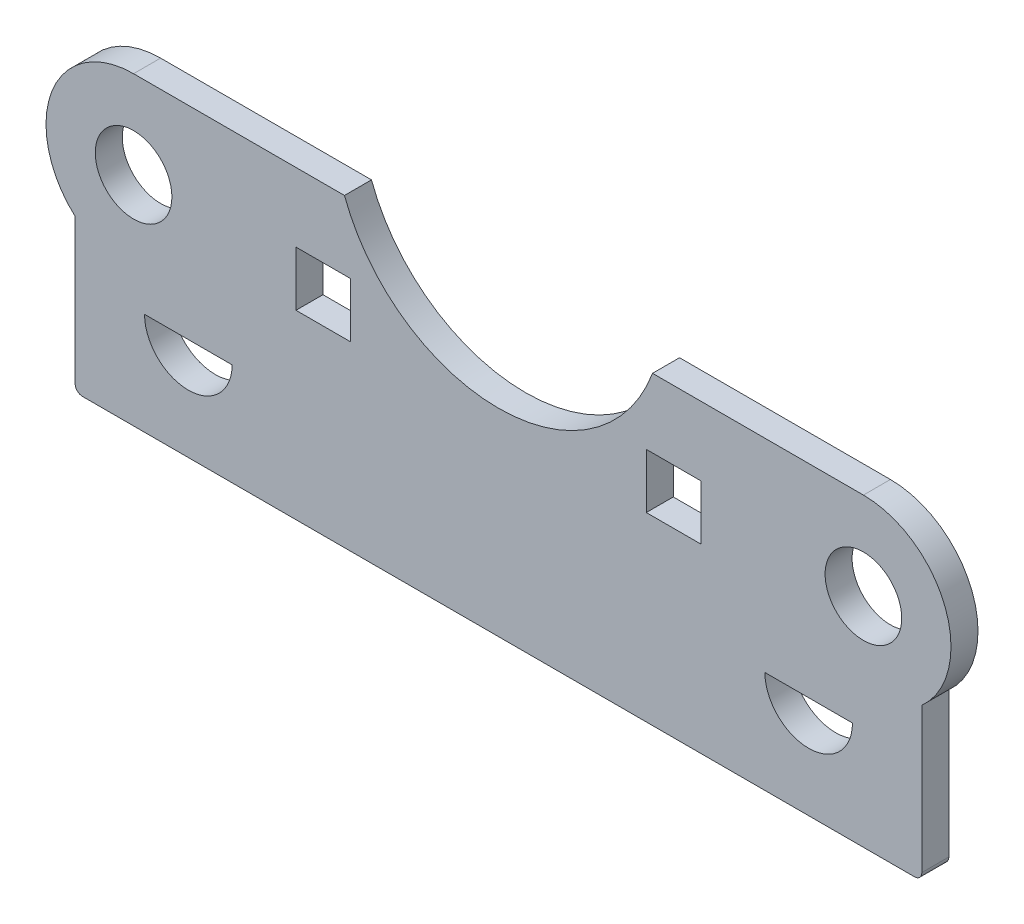
ISO-10303-21;
HEADER;
FILE_DESCRIPTION(('STEP AP214'),'2;1');
FILE_NAME('part.step','',(''),(''),'','','');
FILE_SCHEMA(('AUTOMOTIVE_DESIGN { 1 0 10303 214 1 1 1 1 }'));
ENDSEC;
DATA;
#1=APPLICATION_CONTEXT('core data for automotive mechanical design processes');
#2=APPLICATION_PROTOCOL_DEFINITION('international standard','automotive_design',2000,#1);
#3=PRODUCT_CONTEXT('',#1,'mechanical');
#4=PRODUCT('Part','Part','',(#3));
#5=PRODUCT_RELATED_PRODUCT_CATEGORY('part','',(#4));
#6=PRODUCT_DEFINITION_FORMATION('','',#4);
#7=PRODUCT_DEFINITION_CONTEXT('part definition',#1,'design');
#8=PRODUCT_DEFINITION('design','',#6,#7);
#9=PRODUCT_DEFINITION_SHAPE('','',#8);
#10=(LENGTH_UNIT() NAMED_UNIT(*) SI_UNIT(.MILLI.,.METRE.));
#11=(NAMED_UNIT(*) PLANE_ANGLE_UNIT() SI_UNIT($,.RADIAN.));
#12=(NAMED_UNIT(*) SI_UNIT($,.STERADIAN.) SOLID_ANGLE_UNIT());
#13=UNCERTAINTY_MEASURE_WITH_UNIT(LENGTH_MEASURE(1.E-05),#10,'distance_accuracy_value','');
#14=(GEOMETRIC_REPRESENTATION_CONTEXT(3) GLOBAL_UNCERTAINTY_ASSIGNED_CONTEXT((#13)) GLOBAL_UNIT_ASSIGNED_CONTEXT((#10,
#11,#12)) REPRESENTATION_CONTEXT('',''));
#15=CARTESIAN_POINT('',(0.,0.,0.));
#16=DIRECTION('',(0.,0.,1.));
#17=DIRECTION('',(1.,0.,0.));
#18=AXIS2_PLACEMENT_3D('',#15,#16,#17);
#19=CARTESIAN_POINT('',(-1974.85,0.,-93.98));
#20=DIRECTION('',(-1.,0.,0.));
#21=DIRECTION('',(0.,0.,1.));
#22=AXIS2_PLACEMENT_3D('',#19,#20,#21);
#23=PLANE('',#22);
#24=DIRECTION('',(0.,-1.,0.));
#25=VECTOR('',#24,1.);
#26=CARTESIAN_POINT('',(-1974.85,0.,0.));
#27=LINE('',#26,#25);
#28=CARTESIAN_POINT('',(-1974.85,64.7699999999994,0.));
#29=VERTEX_POINT('',#28);
#30=CARTESIAN_POINT('',(-1974.85,-125.730000000001,0.));
#31=VERTEX_POINT('',#30);
#32=EDGE_CURVE('E263',#29,#31,#27,.T.);
#33=ORIENTED_EDGE('',*,*,#32,.T.);
#34=DIRECTION('',(0.,0.,1.));
#35=VECTOR('',#34,1.);
#36=CARTESIAN_POINT('',(-1974.85,-125.730000000001,-93.98));
#37=LINE('',#36,#35);
#38=CARTESIAN_POINT('',(-1974.85,-125.730000000001,-93.98));
#39=VERTEX_POINT('',#38);
#40=EDGE_CURVE('E11',#39,#31,#37,.T.);
#41=ORIENTED_EDGE('',*,*,#40,.F.);
#42=DIRECTION('',(0.,-1.,0.));
#43=VECTOR('',#42,1.);
#44=CARTESIAN_POINT('',(-1974.85,0.,-93.98));
#45=LINE('',#44,#43);
#46=CARTESIAN_POINT('',(-1974.85,64.7699999999994,-93.98));
#47=VERTEX_POINT('',#46);
#48=EDGE_CURVE('E52',#47,#39,#45,.T.);
#49=ORIENTED_EDGE('',*,*,#48,.F.);
#50=DIRECTION('',(0.,0.,1.));
#51=VECTOR('',#50,1.);
#52=CARTESIAN_POINT('',(-1974.85,64.7699999999994,-93.98));
#53=LINE('',#52,#51);
#54=EDGE_CURVE('E197',#47,#29,#53,.T.);
#55=ORIENTED_EDGE('',*,*,#54,.T.);
#56=EDGE_LOOP('',(#33,#41,#49,#55));
#57=FACE_BOUND('',#56,.T.);
#58=ADVANCED_FACE('F33',(#57),#23,.F.);
#59=CARTESIAN_POINT('',(0.,-125.73,-93.98));
#60=DIRECTION('',(0.,1.,0.));
#61=DIRECTION('',(-1.,0.,0.));
#62=AXIS2_PLACEMENT_3D('',#59,#60,#61);
#63=PLANE('',#62);
#64=DIRECTION('',(-1.,0.,0.));
#65=VECTOR('',#64,1.);
#66=CARTESIAN_POINT('',(0.,-125.73,0.));
#67=LINE('',#66,#65);
#68=CARTESIAN_POINT('',(-1784.35,-125.730000000001,0.));
#69=VERTEX_POINT('',#68);
#70=EDGE_CURVE('E268',#69,#31,#67,.T.);
#71=ORIENTED_EDGE('',*,*,#70,.F.);
#72=DIRECTION('',(0.,0.,1.));
#73=VECTOR('',#72,1.);
#74=CARTESIAN_POINT('',(-1784.35,-125.730000000001,-93.98));
#75=LINE('',#74,#73);
#76=CARTESIAN_POINT('',(-1784.35,-125.730000000001,-93.98));
#77=VERTEX_POINT('',#76);
#78=EDGE_CURVE('E43',#77,#69,#75,.T.);
#79=ORIENTED_EDGE('',*,*,#78,.F.);
#80=DIRECTION('',(-1.,0.,0.));
#81=VECTOR('',#80,1.);
#82=CARTESIAN_POINT('',(0.,-125.73,-93.98));
#83=LINE('',#82,#81);
#84=EDGE_CURVE('E205',#77,#39,#83,.T.);
#85=ORIENTED_EDGE('',*,*,#84,.T.);
#86=ORIENTED_EDGE('',*,*,#40,.T.);
#87=EDGE_LOOP('',(#71,#79,#85,#86));
#88=FACE_BOUND('',#87,.T.);
#89=ADVANCED_FACE('F337',(#88),#63,.T.);
#90=CARTESIAN_POINT('',(-1784.35,0.,-93.98));
#91=DIRECTION('',(-1.,0.,0.));
#92=DIRECTION('',(0.,0.,1.));
#93=AXIS2_PLACEMENT_3D('',#90,#91,#92);
#94=PLANE('',#93);
#95=DIRECTION('',(0.,-1.,0.));
#96=VECTOR('',#95,1.);
#97=CARTESIAN_POINT('',(-1784.35,0.,0.));
#98=LINE('',#97,#96);
#99=CARTESIAN_POINT('',(-1784.35,64.7699999999995,0.));
#100=VERTEX_POINT('',#99);
#101=EDGE_CURVE('E194',#100,#69,#98,.T.);
#102=ORIENTED_EDGE('',*,*,#101,.F.);
#103=DIRECTION('',(0.,0.,1.));
#104=VECTOR('',#103,1.);
#105=CARTESIAN_POINT('',(-1784.35,64.7699999999995,-93.98));
#106=LINE('',#105,#104);
#107=CARTESIAN_POINT('',(-1784.35,64.7699999999995,-93.98));
#108=VERTEX_POINT('',#107);
#109=EDGE_CURVE('E189',#108,#100,#106,.T.);
#110=ORIENTED_EDGE('',*,*,#109,.F.);
#111=DIRECTION('',(0.,-1.,0.));
#112=VECTOR('',#111,1.);
#113=CARTESIAN_POINT('',(-1784.35,0.,-93.98));
#114=LINE('',#113,#112);
#115=EDGE_CURVE('E193',#108,#77,#114,.T.);
#116=ORIENTED_EDGE('',*,*,#115,.T.);
#117=ORIENTED_EDGE('',*,*,#78,.T.);
#118=EDGE_LOOP('',(#102,#110,#116,#117));
#119=FACE_BOUND('',#118,.T.);
#120=ADVANCED_FACE('F191',(#119),#94,.T.);
#121=CARTESIAN_POINT('',(-755.65,-4.40388466434645E-13,-93.98));
#122=DIRECTION('',(-1.,0.,0.));
#123=DIRECTION('',(0.,-1.,0.));
#124=AXIS2_PLACEMENT_3D('',#121,#122,#123);
#125=PLANE('',#124);
#126=DIRECTION('',(0.,-1.,0.));
#127=VECTOR('',#126,1.);
#128=CARTESIAN_POINT('',(-755.65,-4.40388466434645E-13,0.));
#129=LINE('',#128,#127);
#130=CARTESIAN_POINT('',(-755.65,64.7699999999998,0.));
#131=VERTEX_POINT('',#130);
#132=CARTESIAN_POINT('',(-755.649999999999,-125.73,0.));
#133=VERTEX_POINT('',#132);
#134=EDGE_CURVE('E252',#131,#133,#129,.T.);
#135=ORIENTED_EDGE('',*,*,#134,.T.);
#136=DIRECTION('',(0.,0.,1.));
#137=VECTOR('',#136,1.);
#138=CARTESIAN_POINT('',(-755.649999999999,-125.73,-93.98));
#139=LINE('',#138,#137);
#140=CARTESIAN_POINT('',(-755.649999999999,-125.73,-93.98));
#141=VERTEX_POINT('',#140);
#142=EDGE_CURVE('E274',#141,#133,#139,.T.);
#143=ORIENTED_EDGE('',*,*,#142,.F.);
#144=DIRECTION('',(0.,-1.,0.));
#145=VECTOR('',#144,1.);
#146=CARTESIAN_POINT('',(-755.65,-4.40388466434645E-13,-93.98));
#147=LINE('',#146,#145);
#148=CARTESIAN_POINT('',(-755.65,64.7699999999998,-93.98));
#149=VERTEX_POINT('',#148);
#150=EDGE_CURVE('E459',#149,#141,#147,.T.);
#151=ORIENTED_EDGE('',*,*,#150,.F.);
#152=DIRECTION('',(0.,0.,1.));
#153=VECTOR('',#152,1.);
#154=CARTESIAN_POINT('',(-755.65,64.7699999999998,-93.98));
#155=LINE('',#154,#153);
#156=EDGE_CURVE('E280',#149,#131,#155,.T.);
#157=ORIENTED_EDGE('',*,*,#156,.T.);
#158=EDGE_LOOP('',(#135,#143,#151,#157));
#159=FACE_BOUND('',#158,.T.);
#160=ADVANCED_FACE('F350',(#159),#125,.F.);
#161=CARTESIAN_POINT('',(0.,-125.73,-93.98));
#162=DIRECTION('',(0.,1.,0.));
#163=DIRECTION('',(-1.,0.,0.));
#164=AXIS2_PLACEMENT_3D('',#161,#162,#163);
#165=PLANE('',#164);
#166=DIRECTION('',(-1.,0.,0.));
#167=VECTOR('',#166,1.);
#168=CARTESIAN_POINT('',(0.,-125.73,0.));
#169=LINE('',#168,#167);
#170=CARTESIAN_POINT('',(-565.15,-125.73,0.));
#171=VERTEX_POINT('',#170);
#172=EDGE_CURVE('E260',#171,#133,#169,.T.);
#173=ORIENTED_EDGE('',*,*,#172,.F.);
#174=DIRECTION('',(0.,0.,1.));
#175=VECTOR('',#174,1.);
#176=CARTESIAN_POINT('',(-565.15,-125.73,-93.98));
#177=LINE('',#176,#175);
#178=CARTESIAN_POINT('',(-565.15,-125.73,-93.98));
#179=VERTEX_POINT('',#178);
#180=EDGE_CURVE('E276',#179,#171,#177,.T.);
#181=ORIENTED_EDGE('',*,*,#180,.F.);
#182=DIRECTION('',(-1.,0.,0.));
#183=VECTOR('',#182,1.);
#184=CARTESIAN_POINT('',(0.,-125.73,-93.98));
#185=LINE('',#184,#183);
#186=EDGE_CURVE('E466',#179,#141,#185,.T.);
#187=ORIENTED_EDGE('',*,*,#186,.T.);
#188=ORIENTED_EDGE('',*,*,#142,.T.);
#189=EDGE_LOOP('',(#173,#181,#187,#188));
#190=FACE_BOUND('',#189,.T.);
#191=ADVANCED_FACE('F346',(#190),#165,.T.);
#192=CARTESIAN_POINT('',(-565.15,0.,-93.98));
#193=DIRECTION('',(-1.,0.,0.));
#194=DIRECTION('',(0.,0.,1.));
#195=AXIS2_PLACEMENT_3D('',#192,#193,#194);
#196=PLANE('',#195);
#197=DIRECTION('',(0.,-1.,0.));
#198=VECTOR('',#197,1.);
#199=CARTESIAN_POINT('',(-565.15,0.,0.));
#200=LINE('',#199,#198);
#201=CARTESIAN_POINT('',(-565.15,64.7699999999998,0.));
#202=VERTEX_POINT('',#201);
#203=EDGE_CURVE('E257',#202,#171,#200,.T.);
#204=ORIENTED_EDGE('',*,*,#203,.F.);
#205=DIRECTION('',(0.,0.,1.));
#206=VECTOR('',#205,1.);
#207=CARTESIAN_POINT('',(-565.15,64.7699999999998,-93.98));
#208=LINE('',#207,#206);
#209=CARTESIAN_POINT('',(-565.15,64.7699999999998,-93.98));
#210=VERTEX_POINT('',#209);
#211=EDGE_CURVE('E278',#210,#202,#208,.T.);
#212=ORIENTED_EDGE('',*,*,#211,.F.);
#213=DIRECTION('',(0.,-1.,0.));
#214=VECTOR('',#213,1.);
#215=CARTESIAN_POINT('',(-565.15,0.,-93.98));
#216=LINE('',#215,#214);
#217=EDGE_CURVE('E463',#210,#179,#216,.T.);
#218=ORIENTED_EDGE('',*,*,#217,.T.);
#219=ORIENTED_EDGE('',*,*,#180,.T.);
#220=EDGE_LOOP('',(#204,#212,#218,#219));
#221=FACE_BOUND('',#220,.T.);
#222=ADVANCED_FACE('F349',(#221),#196,.T.);
#223=CARTESIAN_POINT('',(-2717.8,-731.520000000001,-93.98));
#224=DIRECTION('',(0.,0.,1.));
#225=DIRECTION('',(1.,0.,0.));
#226=AXIS2_PLACEMENT_3D('',#223,#224,#225);
#227=CYLINDRICAL_SURFACE('',#226,25.3999999999999);
#228=CARTESIAN_POINT('',(-2717.8,-731.520000000001,0.));
#229=DIRECTION('',(0.,0.,1.));
#230=DIRECTION('',(1.,0.,0.));
#231=AXIS2_PLACEMENT_3D('',#228,#229,#230);
#232=CIRCLE('',#231,25.3999999999999);
#233=CARTESIAN_POINT('',(-2717.8,-756.920000000001,0.));
#234=VERTEX_POINT('',#233);
#235=CARTESIAN_POINT('',(-2743.2,-731.520000000001,0.));
#236=VERTEX_POINT('',#235);
#237=EDGE_CURVE('E220',#234,#236,#232,.F.);
#238=ORIENTED_EDGE('',*,*,#237,.T.);
#239=DIRECTION('',(0.,0.,1.));
#240=VECTOR('',#239,1.);
#241=CARTESIAN_POINT('',(-2743.2,-731.520000000001,-93.98));
#242=LINE('',#241,#240);
#243=CARTESIAN_POINT('',(-2743.2,-731.520000000001,-93.98));
#244=VERTEX_POINT('',#243);
#245=EDGE_CURVE('E283',#244,#236,#242,.T.);
#246=ORIENTED_EDGE('',*,*,#245,.F.);
#247=CARTESIAN_POINT('',(-2717.8,-731.520000000001,-93.98));
#248=DIRECTION('',(0.,0.,1.));
#249=DIRECTION('',(1.,0.,0.));
#250=AXIS2_PLACEMENT_3D('',#247,#248,#249);
#251=CIRCLE('',#250,25.3999999999999);
#252=CARTESIAN_POINT('',(-2717.8,-756.920000000001,-93.98));
#253=VERTEX_POINT('',#252);
#254=EDGE_CURVE('E422',#253,#244,#251,.F.);
#255=ORIENTED_EDGE('',*,*,#254,.F.);
#256=DIRECTION('',(0.,0.,1.));
#257=VECTOR('',#256,1.);
#258=CARTESIAN_POINT('',(-2717.8,-756.920000000001,-93.98));
#259=LINE('',#258,#257);
#260=EDGE_CURVE('E305',#253,#234,#259,.T.);
#261=ORIENTED_EDGE('',*,*,#260,.T.);
#262=EDGE_LOOP('',(#238,#246,#255,#261));
#263=FACE_BOUND('',#262,.T.);
#264=ADVANCED_FACE('F354',(#263),#227,.T.);
#265=CARTESIAN_POINT('',(-2743.2,0.,-93.98));
#266=DIRECTION('',(1.,0.,0.));
#267=DIRECTION('',(0.,0.,-1.));
#268=AXIS2_PLACEMENT_3D('',#265,#266,#267);
#269=PLANE('',#268);
#270=DIRECTION('',(0.,1.,0.));
#271=VECTOR('',#270,1.);
#272=CARTESIAN_POINT('',(-2743.2,0.,0.));
#273=LINE('',#272,#271);
#274=CARTESIAN_POINT('',(-2743.2,-227.184506513979,0.));
#275=VERTEX_POINT('',#274);
#276=EDGE_CURVE('E243',#236,#275,#273,.T.);
#277=ORIENTED_EDGE('',*,*,#276,.T.);
#278=DIRECTION('',(0.,0.,1.));
#279=VECTOR('',#278,1.);
#280=CARTESIAN_POINT('',(-2743.2,-227.184506513979,-93.98));
#281=LINE('',#280,#279);
#282=CARTESIAN_POINT('',(-2743.2,-227.184506513979,-93.98));
#283=VERTEX_POINT('',#282);
#284=EDGE_CURVE('E286',#283,#275,#281,.T.);
#285=ORIENTED_EDGE('',*,*,#284,.F.);
#286=DIRECTION('',(0.,1.,0.));
#287=VECTOR('',#286,1.);
#288=CARTESIAN_POINT('',(-2743.2,0.,-93.98));
#289=LINE('',#288,#287);
#290=EDGE_CURVE('E451',#244,#283,#289,.T.);
#291=ORIENTED_EDGE('',*,*,#290,.F.);
#292=ORIENTED_EDGE('',*,*,#245,.T.);
#293=EDGE_LOOP('',(#277,#285,#291,#292));
#294=FACE_BOUND('',#293,.T.);
#295=ADVANCED_FACE('F371',(#294),#269,.F.);
#296=CARTESIAN_POINT('',(-2540.,0.,-93.98));
#297=DIRECTION('',(0.,0.,1.));
#298=DIRECTION('',(1.,0.,0.));
#299=AXIS2_PLACEMENT_3D('',#296,#297,#298);
#300=CYLINDRICAL_SURFACE('',#299,304.8);
#301=CARTESIAN_POINT('',(-2540.,0.,0.));
#302=DIRECTION('',(0.,0.,1.));
#303=DIRECTION('',(1.,0.,0.));
#304=AXIS2_PLACEMENT_3D('',#301,#302,#303);
#305=CIRCLE('',#304,304.8);
#306=CARTESIAN_POINT('',(-2540.,304.8,0.));
#307=VERTEX_POINT('',#306);
#308=EDGE_CURVE('E240',#307,#275,#305,.T.);
#309=ORIENTED_EDGE('',*,*,#308,.F.);
#310=DIRECTION('',(0.,0.,1.));
#311=VECTOR('',#310,1.);
#312=CARTESIAN_POINT('',(-2540.,304.8,-93.98));
#313=LINE('',#312,#311);
#314=CARTESIAN_POINT('',(-2540.,304.8,-93.98));
#315=VERTEX_POINT('',#314);
#316=EDGE_CURVE('E288',#315,#307,#313,.T.);
#317=ORIENTED_EDGE('',*,*,#316,.F.);
#318=CARTESIAN_POINT('',(-2540.,0.,-93.98));
#319=DIRECTION('',(0.,0.,1.));
#320=DIRECTION('',(1.,0.,0.));
#321=AXIS2_PLACEMENT_3D('',#318,#319,#320);
#322=CIRCLE('',#321,304.8);
#323=EDGE_CURVE('E448',#315,#283,#322,.T.);
#324=ORIENTED_EDGE('',*,*,#323,.T.);
#325=ORIENTED_EDGE('',*,*,#284,.T.);
#326=EDGE_LOOP('',(#309,#317,#324,#325));
#327=FACE_BOUND('',#326,.T.);
#328=ADVANCED_FACE('F374',(#327),#300,.T.);
#329=CARTESIAN_POINT('',(0.,304.8,-93.98));
#330=DIRECTION('',(0.,-1.,0.));
#331=DIRECTION('',(0.,0.,-1.));
#332=AXIS2_PLACEMENT_3D('',#329,#330,#331);
#333=PLANE('',#332);
#334=DIRECTION('',(1.,0.,0.));
#335=VECTOR('',#334,1.);
#336=CARTESIAN_POINT('',(0.,304.8,0.));
#337=LINE('',#336,#335);
#338=CARTESIAN_POINT('',(-1806.06036563059,304.8,0.));
#339=VERTEX_POINT('',#338);
#340=EDGE_CURVE('E238',#307,#339,#337,.T.);
#341=ORIENTED_EDGE('',*,*,#340,.T.);
#342=DIRECTION('',(0.,0.,1.));
#343=VECTOR('',#342,1.);
#344=CARTESIAN_POINT('',(-1806.06036563059,304.8,-93.98));
#345=LINE('',#344,#343);
#346=CARTESIAN_POINT('',(-1806.06036563059,304.8,-93.98));
#347=VERTEX_POINT('',#346);
#348=EDGE_CURVE('E290',#347,#339,#345,.T.);
#349=ORIENTED_EDGE('',*,*,#348,.F.);
#350=DIRECTION('',(1.,0.,0.));
#351=VECTOR('',#350,1.);
#352=CARTESIAN_POINT('',(0.,304.8,-93.98));
#353=LINE('',#352,#351);
#354=EDGE_CURVE('E446',#315,#347,#353,.T.);
#355=ORIENTED_EDGE('',*,*,#354,.F.);
#356=ORIENTED_EDGE('',*,*,#316,.T.);
#357=EDGE_LOOP('',(#341,#349,#355,#356));
#358=FACE_BOUND('',#357,.T.);
#359=ADVANCED_FACE('F378',(#358),#333,.F.);
#360=CARTESIAN_POINT('',(-1270.,502.92,-93.98));
#361=DIRECTION('',(0.,0.,1.));
#362=DIRECTION('',(1.,0.,0.));
#363=AXIS2_PLACEMENT_3D('',#360,#361,#362);
#364=CYLINDRICAL_SURFACE('',#363,571.5);
#365=CARTESIAN_POINT('',(-1270.,502.92,0.));
#366=DIRECTION('',(0.,0.,1.));
#367=DIRECTION('',(1.,0.,0.));
#368=AXIS2_PLACEMENT_3D('',#365,#366,#367);
#369=CIRCLE('',#368,571.5);
#370=CARTESIAN_POINT('',(-733.939634369412,304.8,0.));
#371=VERTEX_POINT('',#370);
#372=EDGE_CURVE('E236',#339,#371,#369,.T.);
#373=ORIENTED_EDGE('',*,*,#372,.T.);
#374=DIRECTION('',(0.,0.,1.));
#375=VECTOR('',#374,1.);
#376=CARTESIAN_POINT('',(-733.939634369412,304.8,-93.98));
#377=LINE('',#376,#375);
#378=CARTESIAN_POINT('',(-733.939634369412,304.8,-93.98));
#379=VERTEX_POINT('',#378);
#380=EDGE_CURVE('E293',#379,#371,#377,.T.);
#381=ORIENTED_EDGE('',*,*,#380,.F.);
#382=CARTESIAN_POINT('',(-1270.,502.92,-93.98));
#383=DIRECTION('',(0.,0.,1.));
#384=DIRECTION('',(1.,0.,0.));
#385=AXIS2_PLACEMENT_3D('',#382,#383,#384);
#386=CIRCLE('',#385,571.5);
#387=EDGE_CURVE('E444',#347,#379,#386,.T.);
#388=ORIENTED_EDGE('',*,*,#387,.F.);
#389=ORIENTED_EDGE('',*,*,#348,.T.);
#390=EDGE_LOOP('',(#373,#381,#388,#389));
#391=FACE_BOUND('',#390,.T.);
#392=ADVANCED_FACE('F382',(#391),#364,.F.);
#393=CARTESIAN_POINT('',(0.,304.8,-93.98));
#394=DIRECTION('',(0.,-1.,0.));
#395=DIRECTION('',(1.,0.,0.));
#396=AXIS2_PLACEMENT_3D('',#393,#394,#395);
#397=PLANE('',#396);
#398=DIRECTION('',(1.,0.,0.));
#399=VECTOR('',#398,1.);
#400=CARTESIAN_POINT('',(0.,304.8,0.));
#401=LINE('',#400,#399);
#402=CARTESIAN_POINT('',(0.,304.8,0.));
#403=VERTEX_POINT('',#402);
#404=EDGE_CURVE('E233',#371,#403,#401,.T.);
#405=ORIENTED_EDGE('',*,*,#404,.T.);
#406=DIRECTION('',(0.,0.,1.));
#407=VECTOR('',#406,1.);
#408=CARTESIAN_POINT('',(0.,304.8,-93.98));
#409=LINE('',#408,#407);
#410=CARTESIAN_POINT('',(0.,304.8,-93.98));
#411=VERTEX_POINT('',#410);
#412=EDGE_CURVE('E296',#411,#403,#409,.T.);
#413=ORIENTED_EDGE('',*,*,#412,.F.);
#414=DIRECTION('',(1.,0.,0.));
#415=VECTOR('',#414,1.);
#416=CARTESIAN_POINT('',(0.,304.8,-93.98));
#417=LINE('',#416,#415);
#418=EDGE_CURVE('E442',#379,#411,#417,.T.);
#419=ORIENTED_EDGE('',*,*,#418,.F.);
#420=ORIENTED_EDGE('',*,*,#380,.T.);
#421=EDGE_LOOP('',(#405,#413,#419,#420));
#422=FACE_BOUND('',#421,.T.);
#423=ADVANCED_FACE('F386',(#422),#397,.F.);
#424=CARTESIAN_POINT('',(0.,0.,-93.98));
#425=DIRECTION('',(0.,0.,1.));
#426=DIRECTION('',(1.,0.,0.));
#427=AXIS2_PLACEMENT_3D('',#424,#425,#426);
#428=CYLINDRICAL_SURFACE('',#427,304.8);
#429=CARTESIAN_POINT('',(0.,0.,0.));
#430=DIRECTION('',(0.,0.,1.));
#431=DIRECTION('',(1.,0.,0.));
#432=AXIS2_PLACEMENT_3D('',#429,#430,#431);
#433=CIRCLE('',#432,304.8);
#434=CARTESIAN_POINT('',(203.2,-227.184506513979,0.));
#435=VERTEX_POINT('',#434);
#436=EDGE_CURVE('E230',#435,#403,#433,.T.);
#437=ORIENTED_EDGE('',*,*,#436,.F.);
#438=DIRECTION('',(0.,0.,1.));
#439=VECTOR('',#438,1.);
#440=CARTESIAN_POINT('',(203.2,-227.184506513979,-93.98));
#441=LINE('',#440,#439);
#442=CARTESIAN_POINT('',(203.2,-227.184506513979,-93.98));
#443=VERTEX_POINT('',#442);
#444=EDGE_CURVE('E298',#443,#435,#441,.T.);
#445=ORIENTED_EDGE('',*,*,#444,.F.);
#446=CARTESIAN_POINT('',(0.,0.,-93.98));
#447=DIRECTION('',(0.,0.,1.));
#448=DIRECTION('',(1.,0.,0.));
#449=AXIS2_PLACEMENT_3D('',#446,#447,#448);
#450=CIRCLE('',#449,304.8);
#451=EDGE_CURVE('E439',#443,#411,#450,.T.);
#452=ORIENTED_EDGE('',*,*,#451,.T.);
#453=ORIENTED_EDGE('',*,*,#412,.T.);
#454=EDGE_LOOP('',(#437,#445,#452,#453));
#455=FACE_BOUND('',#454,.T.);
#456=ADVANCED_FACE('F390',(#455),#428,.T.);
#457=CARTESIAN_POINT('',(203.2,0.,-93.98));
#458=DIRECTION('',(1.,0.,0.));
#459=DIRECTION('',(0.,0.,-1.));
#460=AXIS2_PLACEMENT_3D('',#457,#458,#459);
#461=PLANE('',#460);
#462=DIRECTION('',(0.,1.,0.));
#463=VECTOR('',#462,1.);
#464=CARTESIAN_POINT('',(203.2,0.,0.));
#465=LINE('',#464,#463);
#466=CARTESIAN_POINT('',(203.2,-731.52,0.));
#467=VERTEX_POINT('',#466);
#468=EDGE_CURVE('E227',#467,#435,#465,.T.);
#469=ORIENTED_EDGE('',*,*,#468,.F.);
#470=DIRECTION('',(0.,0.,1.));
#471=VECTOR('',#470,1.);
#472=CARTESIAN_POINT('',(203.2,-731.52,-93.98));
#473=LINE('',#472,#471);
#474=CARTESIAN_POINT('',(203.2,-731.52,-93.98));
#475=VERTEX_POINT('',#474);
#476=EDGE_CURVE('E300',#475,#467,#473,.T.);
#477=ORIENTED_EDGE('',*,*,#476,.F.);
#478=DIRECTION('',(0.,1.,0.));
#479=VECTOR('',#478,1.);
#480=CARTESIAN_POINT('',(203.2,0.,-93.98));
#481=LINE('',#480,#479);
#482=EDGE_CURVE('E436',#475,#443,#481,.T.);
#483=ORIENTED_EDGE('',*,*,#482,.T.);
#484=ORIENTED_EDGE('',*,*,#444,.T.);
#485=EDGE_LOOP('',(#469,#477,#483,#484));
#486=FACE_BOUND('',#485,.T.);
#487=ADVANCED_FACE('F394',(#486),#461,.T.);
#488=CARTESIAN_POINT('',(177.8,-731.52,-93.98));
#489=DIRECTION('',(0.,0.,1.));
#490=DIRECTION('',(1.,0.,0.));
#491=AXIS2_PLACEMENT_3D('',#488,#489,#490);
#492=CYLINDRICAL_SURFACE('',#491,25.4);
#493=CARTESIAN_POINT('',(177.8,-731.52,0.));
#494=DIRECTION('',(0.,0.,1.));
#495=DIRECTION('',(1.,0.,0.));
#496=AXIS2_PLACEMENT_3D('',#493,#494,#495);
#497=CIRCLE('',#496,25.4);
#498=CARTESIAN_POINT('',(177.8,-756.92,0.));
#499=VERTEX_POINT('',#498);
#500=EDGE_CURVE('E225',#467,#499,#497,.F.);
#501=ORIENTED_EDGE('',*,*,#500,.T.);
#502=DIRECTION('',(0.,0.,1.));
#503=VECTOR('',#502,1.);
#504=CARTESIAN_POINT('',(177.8,-756.92,-93.98));
#505=LINE('',#504,#503);
#506=CARTESIAN_POINT('',(177.8,-756.92,-93.98));
#507=VERTEX_POINT('',#506);
#508=EDGE_CURVE('E302',#507,#499,#505,.T.);
#509=ORIENTED_EDGE('',*,*,#508,.F.);
#510=CARTESIAN_POINT('',(177.8,-731.52,-93.98));
#511=DIRECTION('',(0.,0.,1.));
#512=DIRECTION('',(1.,0.,0.));
#513=AXIS2_PLACEMENT_3D('',#510,#511,#512);
#514=CIRCLE('',#513,25.4);
#515=EDGE_CURVE('E434',#475,#507,#514,.F.);
#516=ORIENTED_EDGE('',*,*,#515,.F.);
#517=ORIENTED_EDGE('',*,*,#476,.T.);
#518=EDGE_LOOP('',(#501,#509,#516,#517));
#519=FACE_BOUND('',#518,.T.);
#520=ADVANCED_FACE('F398',(#519),#492,.T.);
#521=CARTESIAN_POINT('',(-2349.5,-401.32,-93.98));
#522=DIRECTION('',(0.,0.,1.));
#523=DIRECTION('',(1.,0.,0.));
#524=AXIS2_PLACEMENT_3D('',#521,#522,#523);
#525=CYLINDRICAL_SURFACE('',#524,152.4);
#526=CARTESIAN_POINT('',(-2349.5,-401.32,0.));
#527=DIRECTION('',(0.,0.,1.));
#528=DIRECTION('',(1.,0.,0.));
#529=AXIS2_PLACEMENT_3D('',#526,#527,#528);
#530=CIRCLE('',#529,152.4);
#531=CARTESIAN_POINT('',(-2501.9,-401.32,0.));
#532=VERTEX_POINT('',#531);
#533=CARTESIAN_POINT('',(-2197.1,-401.32,0.));
#534=VERTEX_POINT('',#533);
#535=EDGE_CURVE('E215',#532,#534,#530,.T.);
#536=ORIENTED_EDGE('',*,*,#535,.T.);
#537=DIRECTION('',(0.,0.,1.));
#538=VECTOR('',#537,1.);
#539=CARTESIAN_POINT('',(-2197.1,-401.32,-93.98));
#540=LINE('',#539,#538);
#541=CARTESIAN_POINT('',(-2197.1,-401.32,-93.98));
#542=VERTEX_POINT('',#541);
#543=EDGE_CURVE('E308',#542,#534,#540,.T.);
#544=ORIENTED_EDGE('',*,*,#543,.F.);
#545=CARTESIAN_POINT('',(-2349.5,-401.32,-93.98));
#546=DIRECTION('',(0.,0.,1.));
#547=DIRECTION('',(1.,0.,0.));
#548=AXIS2_PLACEMENT_3D('',#545,#546,#547);
#549=CIRCLE('',#548,152.4);
#550=CARTESIAN_POINT('',(-2501.9,-401.32,-93.98));
#551=VERTEX_POINT('',#550);
#552=EDGE_CURVE('E423',#551,#542,#549,.T.);
#553=ORIENTED_EDGE('',*,*,#552,.F.);
#554=DIRECTION('',(0.,0.,1.));
#555=VECTOR('',#554,1.);
#556=CARTESIAN_POINT('',(-2501.9,-401.32,-93.98));
#557=LINE('',#556,#555);
#558=EDGE_CURVE('E311',#551,#532,#557,.T.);
#559=ORIENTED_EDGE('',*,*,#558,.T.);
#560=EDGE_LOOP('',(#536,#544,#553,#559));
#561=FACE_BOUND('',#560,.T.);
#562=ADVANCED_FACE('F402',(#561),#525,.F.);
#563=CARTESIAN_POINT('',(-190.5,-401.32,-93.98));
#564=DIRECTION('',(0.,0.,1.));
#565=DIRECTION('',(1.,0.,0.));
#566=AXIS2_PLACEMENT_3D('',#563,#564,#565);
#567=CYLINDRICAL_SURFACE('',#566,152.4);
#568=CARTESIAN_POINT('',(-190.5,-401.32,0.));
#569=DIRECTION('',(0.,0.,1.));
#570=DIRECTION('',(1.,0.,0.));
#571=AXIS2_PLACEMENT_3D('',#568,#569,#570);
#572=CIRCLE('',#571,152.4);
#573=CARTESIAN_POINT('',(-342.9,-401.32,0.));
#574=VERTEX_POINT('',#573);
#575=CARTESIAN_POINT('',(-38.0999999999997,-401.32,0.));
#576=VERTEX_POINT('',#575);
#577=EDGE_CURVE('E210',#574,#576,#572,.T.);
#578=ORIENTED_EDGE('',*,*,#577,.T.);
#579=DIRECTION('',(0.,0.,1.));
#580=VECTOR('',#579,1.);
#581=CARTESIAN_POINT('',(-38.0999999999997,-401.32,-93.98));
#582=LINE('',#581,#580);
#583=CARTESIAN_POINT('',(-38.0999999999997,-401.32,-93.98));
#584=VERTEX_POINT('',#583);
#585=EDGE_CURVE('E313',#584,#576,#582,.T.);
#586=ORIENTED_EDGE('',*,*,#585,.F.);
#587=CARTESIAN_POINT('',(-190.5,-401.32,-93.98));
#588=DIRECTION('',(0.,0.,1.));
#589=DIRECTION('',(1.,0.,0.));
#590=AXIS2_PLACEMENT_3D('',#587,#588,#589);
#591=CIRCLE('',#590,152.4);
#592=CARTESIAN_POINT('',(-342.9,-401.32,-93.98));
#593=VERTEX_POINT('',#592);
#594=EDGE_CURVE('E270',#593,#584,#591,.T.);
#595=ORIENTED_EDGE('',*,*,#594,.F.);
#596=DIRECTION('',(0.,0.,1.));
#597=VECTOR('',#596,1.);
#598=CARTESIAN_POINT('',(-342.9,-401.32,-93.98));
#599=LINE('',#598,#597);
#600=EDGE_CURVE('E37',#593,#574,#599,.T.);
#601=ORIENTED_EDGE('',*,*,#600,.T.);
#602=EDGE_LOOP('',(#578,#586,#595,#601));
#603=FACE_BOUND('',#602,.T.);
#604=ADVANCED_FACE('F35',(#603),#567,.F.);
#605=CARTESIAN_POINT('',(0.,64.7700000000001,-93.98));
#606=DIRECTION('',(0.,1.,0.));
#607=DIRECTION('',(-1.,0.,0.));
#608=AXIS2_PLACEMENT_3D('',#605,#606,#607);
#609=PLANE('',#608);
#610=DIRECTION('',(-1.,0.,0.));
#611=VECTOR('',#610,1.);
#612=CARTESIAN_POINT('',(0.,64.7700000000001,0.));
#613=LINE('',#612,#611);
#614=EDGE_CURVE('E255',#202,#131,#613,.T.);
#615=ORIENTED_EDGE('',*,*,#614,.T.);
#616=ORIENTED_EDGE('',*,*,#156,.F.);
#617=DIRECTION('',(-1.,0.,0.));
#618=VECTOR('',#617,1.);
#619=CARTESIAN_POINT('',(0.,64.7700000000001,-93.98));
#620=LINE('',#619,#618);
#621=EDGE_CURVE('E461',#210,#149,#620,.T.);
#622=ORIENTED_EDGE('',*,*,#621,.F.);
#623=ORIENTED_EDGE('',*,*,#211,.T.);
#624=EDGE_LOOP('',(#615,#616,#622,#623));
#625=FACE_BOUND('',#624,.T.);
#626=ADVANCED_FACE('F356',(#625),#609,.F.);
#627=CARTESIAN_POINT('',(-2540.,0.,-93.98));
#628=DIRECTION('',(0.,0.,1.));
#629=DIRECTION('',(1.,0.,0.));
#630=AXIS2_PLACEMENT_3D('',#627,#628,#629);
#631=CYLINDRICAL_SURFACE('',#630,133.35);
#632=CARTESIAN_POINT('',(-2540.,0.,-93.98));
#633=DIRECTION('',(0.,0.,1.));
#634=DIRECTION('',(1.,0.,0.));
#635=AXIS2_PLACEMENT_3D('',#632,#633,#634);
#636=CIRCLE('',#635,133.35);
#637=CARTESIAN_POINT('',(-2406.65,0.,-93.98));
#638=VERTEX_POINT('',#637);
#639=EDGE_CURVE('E456',#638,#638,#636,.T.);
#640=ORIENTED_EDGE('',*,*,#639,.F.);
#641=EDGE_LOOP('',(#640));
#642=FACE_BOUND('',#641,.T.);
#643=CARTESIAN_POINT('',(-2540.,0.,0.));
#644=DIRECTION('',(0.,0.,1.));
#645=DIRECTION('',(1.,0.,0.));
#646=AXIS2_PLACEMENT_3D('',#643,#644,#645);
#647=CIRCLE('',#646,133.35);
#648=CARTESIAN_POINT('',(-2406.65,0.,0.));
#649=VERTEX_POINT('',#648);
#650=EDGE_CURVE('E249',#649,#649,#647,.T.);
#651=ORIENTED_EDGE('',*,*,#650,.T.);
#652=EDGE_LOOP('',(#651));
#653=FACE_BOUND('',#652,.T.);
#654=ADVANCED_FACE('F359',(#642,#653),#631,.F.);
#655=CARTESIAN_POINT('',(0.,0.,-93.98));
#656=DIRECTION('',(0.,0.,1.));
#657=DIRECTION('',(1.,0.,0.));
#658=AXIS2_PLACEMENT_3D('',#655,#656,#657);
#659=CYLINDRICAL_SURFACE('',#658,133.35);
#660=CARTESIAN_POINT('',(0.,0.,-93.98));
#661=DIRECTION('',(0.,0.,1.));
#662=DIRECTION('',(1.,0.,0.));
#663=AXIS2_PLACEMENT_3D('',#660,#661,#662);
#664=CIRCLE('',#663,133.35);
#665=CARTESIAN_POINT('',(133.35,0.,-93.98));
#666=VERTEX_POINT('',#665);
#667=EDGE_CURVE('E453',#666,#666,#664,.T.);
#668=ORIENTED_EDGE('',*,*,#667,.F.);
#669=EDGE_LOOP('',(#668));
#670=FACE_BOUND('',#669,.T.);
#671=CARTESIAN_POINT('',(0.,0.,0.));
#672=DIRECTION('',(0.,0.,1.));
#673=DIRECTION('',(1.,0.,0.));
#674=AXIS2_PLACEMENT_3D('',#671,#672,#673);
#675=CIRCLE('',#674,133.35);
#676=CARTESIAN_POINT('',(133.35,0.,0.));
#677=VERTEX_POINT('',#676);
#678=EDGE_CURVE('E246',#677,#677,#675,.T.);
#679=ORIENTED_EDGE('',*,*,#678,.T.);
#680=EDGE_LOOP('',(#679));
#681=FACE_BOUND('',#680,.T.);
#682=ADVANCED_FACE('F366',(#670,#681),#659,.F.);
#683=CARTESIAN_POINT('',(1.8905512076474E-12,-756.919999999994,-93.98));
#684=DIRECTION('',(0.,1.,0.));
#685=DIRECTION('',(-1.,0.,0.));
#686=AXIS2_PLACEMENT_3D('',#683,#684,#685);
#687=PLANE('',#686);
#688=DIRECTION('',(-1.,0.,0.));
#689=VECTOR('',#688,1.);
#690=CARTESIAN_POINT('',(1.8905512076474E-12,-756.919999999994,0.));
#691=LINE('',#690,#689);
#692=EDGE_CURVE('E223',#499,#234,#691,.T.);
#693=ORIENTED_EDGE('',*,*,#692,.T.);
#694=ORIENTED_EDGE('',*,*,#260,.F.);
#695=DIRECTION('',(-1.,0.,0.));
#696=VECTOR('',#695,1.);
#697=CARTESIAN_POINT('',(1.8905512076474E-12,-756.919999999994,-93.98));
#698=LINE('',#697,#696);
#699=EDGE_CURVE('E432',#507,#253,#698,.T.);
#700=ORIENTED_EDGE('',*,*,#699,.F.);
#701=ORIENTED_EDGE('',*,*,#508,.T.);
#702=EDGE_LOOP('',(#693,#694,#700,#701));
#703=FACE_BOUND('',#702,.T.);
#704=ADVANCED_FACE('F332',(#703),#687,.F.);
#705=CARTESIAN_POINT('',(0.,-401.32,-93.98));
#706=DIRECTION('',(0.,1.,0.));
#707=DIRECTION('',(0.,0.,1.));
#708=AXIS2_PLACEMENT_3D('',#705,#706,#707);
#709=PLANE('',#708);
#710=DIRECTION('',(-1.,0.,0.));
#711=VECTOR('',#710,1.);
#712=CARTESIAN_POINT('',(0.,-401.32,0.));
#713=LINE('',#712,#711);
#714=EDGE_CURVE('E218',#534,#532,#713,.T.);
#715=ORIENTED_EDGE('',*,*,#714,.T.);
#716=ORIENTED_EDGE('',*,*,#558,.F.);
#717=DIRECTION('',(-1.,0.,0.));
#718=VECTOR('',#717,1.);
#719=CARTESIAN_POINT('',(0.,-401.32,-93.98));
#720=LINE('',#719,#718);
#721=EDGE_CURVE('E419',#542,#551,#720,.T.);
#722=ORIENTED_EDGE('',*,*,#721,.F.);
#723=ORIENTED_EDGE('',*,*,#543,.T.);
#724=EDGE_LOOP('',(#715,#716,#722,#723));
#725=FACE_BOUND('',#724,.T.);
#726=ADVANCED_FACE('F326',(#725),#709,.F.);
#727=CARTESIAN_POINT('',(0.,-401.32,-93.98));
#728=DIRECTION('',(0.,1.,0.));
#729=DIRECTION('',(0.,0.,1.));
#730=AXIS2_PLACEMENT_3D('',#727,#728,#729);
#731=PLANE('',#730);
#732=DIRECTION('',(-1.,0.,0.));
#733=VECTOR('',#732,1.);
#734=CARTESIAN_POINT('',(0.,-401.32,0.));
#735=LINE('',#734,#733);
#736=EDGE_CURVE('E213',#576,#574,#735,.T.);
#737=ORIENTED_EDGE('',*,*,#736,.T.);
#738=ORIENTED_EDGE('',*,*,#600,.F.);
#739=DIRECTION('',(-1.,0.,0.));
#740=VECTOR('',#739,1.);
#741=CARTESIAN_POINT('',(0.,-401.32,-93.98));
#742=LINE('',#741,#740);
#743=EDGE_CURVE('E135',#584,#593,#742,.T.);
#744=ORIENTED_EDGE('',*,*,#743,.F.);
#745=ORIENTED_EDGE('',*,*,#585,.T.);
#746=EDGE_LOOP('',(#737,#738,#744,#745));
#747=FACE_BOUND('',#746,.T.);
#748=ADVANCED_FACE('F324',(#747),#731,.F.);
#749=CARTESIAN_POINT('',(0.,64.77,-93.98));
#750=DIRECTION('',(0.,1.,0.));
#751=DIRECTION('',(-1.,0.,0.));
#752=AXIS2_PLACEMENT_3D('',#749,#750,#751);
#753=PLANE('',#752);
#754=DIRECTION('',(-1.,0.,0.));
#755=VECTOR('',#754,1.);
#756=CARTESIAN_POINT('',(0.,64.77,0.));
#757=LINE('',#756,#755);
#758=EDGE_CURVE('E265',#100,#29,#757,.T.);
#759=ORIENTED_EDGE('',*,*,#758,.T.);
#760=ORIENTED_EDGE('',*,*,#54,.F.);
#761=DIRECTION('',(-1.,0.,0.));
#762=VECTOR('',#761,1.);
#763=CARTESIAN_POINT('',(0.,64.77,-93.98));
#764=LINE('',#763,#762);
#765=EDGE_CURVE('E200',#108,#47,#764,.T.);
#766=ORIENTED_EDGE('',*,*,#765,.F.);
#767=ORIENTED_EDGE('',*,*,#109,.T.);
#768=EDGE_LOOP('',(#759,#760,#766,#767));
#769=FACE_BOUND('',#768,.T.);
#770=ADVANCED_FACE('F201',(#769),#753,.F.);
#771=CARTESIAN_POINT('',(0.,0.,-93.98));
#772=DIRECTION('',(0.,0.,1.));
#773=DIRECTION('',(1.,0.,0.));
#774=AXIS2_PLACEMENT_3D('',#771,#772,#773);
#775=PLANE('',#774);
#776=ORIENTED_EDGE('',*,*,#594,.T.);
#777=ORIENTED_EDGE('',*,*,#743,.T.);
#778=EDGE_LOOP('',(#776,#777));
#779=FACE_BOUND('',#778,.T.);
#780=ORIENTED_EDGE('',*,*,#552,.T.);
#781=ORIENTED_EDGE('',*,*,#721,.T.);
#782=EDGE_LOOP('',(#780,#781));
#783=FACE_BOUND('',#782,.T.);
#784=ORIENTED_EDGE('',*,*,#254,.T.);
#785=ORIENTED_EDGE('',*,*,#290,.T.);
#786=ORIENTED_EDGE('',*,*,#323,.F.);
#787=ORIENTED_EDGE('',*,*,#354,.T.);
#788=ORIENTED_EDGE('',*,*,#387,.T.);
#789=ORIENTED_EDGE('',*,*,#418,.T.);
#790=ORIENTED_EDGE('',*,*,#451,.F.);
#791=ORIENTED_EDGE('',*,*,#482,.F.);
#792=ORIENTED_EDGE('',*,*,#515,.T.);
#793=ORIENTED_EDGE('',*,*,#699,.T.);
#794=EDGE_LOOP('',(#784,#785,#786,#787,#788,#789,#790,#791,#792,#793));
#795=FACE_BOUND('',#794,.T.);
#796=ORIENTED_EDGE('',*,*,#667,.T.);
#797=EDGE_LOOP('',(#796));
#798=FACE_BOUND('',#797,.T.);
#799=ORIENTED_EDGE('',*,*,#639,.T.);
#800=EDGE_LOOP('',(#799));
#801=FACE_BOUND('',#800,.T.);
#802=ORIENTED_EDGE('',*,*,#150,.T.);
#803=ORIENTED_EDGE('',*,*,#186,.F.);
#804=ORIENTED_EDGE('',*,*,#217,.F.);
#805=ORIENTED_EDGE('',*,*,#621,.T.);
#806=EDGE_LOOP('',(#802,#803,#804,#805));
#807=FACE_BOUND('',#806,.T.);
#808=ORIENTED_EDGE('',*,*,#48,.T.);
#809=ORIENTED_EDGE('',*,*,#84,.F.);
#810=ORIENTED_EDGE('',*,*,#115,.F.);
#811=ORIENTED_EDGE('',*,*,#765,.T.);
#812=EDGE_LOOP('',(#808,#809,#810,#811));
#813=FACE_BOUND('',#812,.T.);
#814=ADVANCED_FACE('F204',(#779,#783,#795,#798,#801,#807,#813),#775,.F.);
#815=CARTESIAN_POINT('',(0.,0.,0.));
#816=DIRECTION('',(0.,0.,1.));
#817=DIRECTION('',(1.,0.,0.));
#818=AXIS2_PLACEMENT_3D('',#815,#816,#817);
#819=PLANE('',#818);
#820=ORIENTED_EDGE('',*,*,#577,.F.);
#821=ORIENTED_EDGE('',*,*,#736,.F.);
#822=EDGE_LOOP('',(#820,#821));
#823=FACE_BOUND('',#822,.T.);
#824=ORIENTED_EDGE('',*,*,#535,.F.);
#825=ORIENTED_EDGE('',*,*,#714,.F.);
#826=EDGE_LOOP('',(#824,#825));
#827=FACE_BOUND('',#826,.T.);
#828=ORIENTED_EDGE('',*,*,#237,.F.);
#829=ORIENTED_EDGE('',*,*,#692,.F.);
#830=ORIENTED_EDGE('',*,*,#500,.F.);
#831=ORIENTED_EDGE('',*,*,#468,.T.);
#832=ORIENTED_EDGE('',*,*,#436,.T.);
#833=ORIENTED_EDGE('',*,*,#404,.F.);
#834=ORIENTED_EDGE('',*,*,#372,.F.);
#835=ORIENTED_EDGE('',*,*,#340,.F.);
#836=ORIENTED_EDGE('',*,*,#308,.T.);
#837=ORIENTED_EDGE('',*,*,#276,.F.);
#838=EDGE_LOOP('',(#828,#829,#830,#831,#832,#833,#834,#835,#836,#837));
#839=FACE_BOUND('',#838,.T.);
#840=ORIENTED_EDGE('',*,*,#678,.F.);
#841=EDGE_LOOP('',(#840));
#842=FACE_BOUND('',#841,.T.);
#843=ORIENTED_EDGE('',*,*,#650,.F.);
#844=EDGE_LOOP('',(#843));
#845=FACE_BOUND('',#844,.T.);
#846=ORIENTED_EDGE('',*,*,#134,.F.);
#847=ORIENTED_EDGE('',*,*,#614,.F.);
#848=ORIENTED_EDGE('',*,*,#203,.T.);
#849=ORIENTED_EDGE('',*,*,#172,.T.);
#850=EDGE_LOOP('',(#846,#847,#848,#849));
#851=FACE_BOUND('',#850,.T.);
#852=ORIENTED_EDGE('',*,*,#32,.F.);
#853=ORIENTED_EDGE('',*,*,#758,.F.);
#854=ORIENTED_EDGE('',*,*,#101,.T.);
#855=ORIENTED_EDGE('',*,*,#70,.T.);
#856=EDGE_LOOP('',(#852,#853,#854,#855));
#857=FACE_BOUND('',#856,.T.);
#858=ADVANCED_FACE('F322',(#823,#827,#839,#842,#845,#851,#857),#819,.T.);
#859=CLOSED_SHELL('',(#58,#89,#120,#160,#191,#222,#264,#295,#328,#359,#392,#423,#456,#487,#520,
#562,#604,#626,#654,#682,#704,#726,#748,#770,#814,#858));
#860=MANIFOLD_SOLID_BREP('B2',#859);
#861=ADVANCED_BREP_SHAPE_REPRESENTATION('',(#18,#860),#14);
#862=SHAPE_DEFINITION_REPRESENTATION(#9,#861);
ENDSEC;
END-ISO-10303-21;
